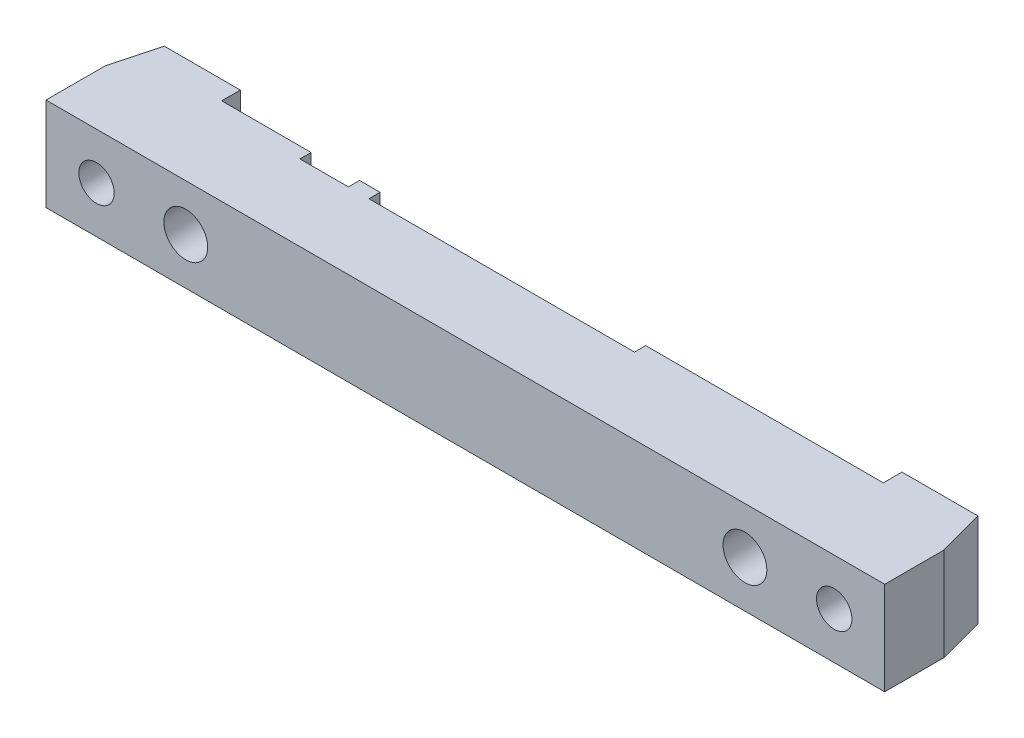
ISO-10303-21;
HEADER;
FILE_DESCRIPTION(('STEP AP214'),'2;1');
FILE_NAME('part.step','',(''),(''),'','','');
FILE_SCHEMA(('AUTOMOTIVE_DESIGN { 1 0 10303 214 1 1 1 1 }'));
ENDSEC;
DATA;
#1=APPLICATION_CONTEXT('core data for automotive mechanical design processes');
#2=APPLICATION_PROTOCOL_DEFINITION('international standard','automotive_design',2000,#1);
#3=PRODUCT_CONTEXT('',#1,'mechanical');
#4=PRODUCT('Part','Part','',(#3));
#5=PRODUCT_RELATED_PRODUCT_CATEGORY('part','',(#4));
#6=PRODUCT_DEFINITION_FORMATION('','',#4);
#7=PRODUCT_DEFINITION_CONTEXT('part definition',#1,'design');
#8=PRODUCT_DEFINITION('design','',#6,#7);
#9=PRODUCT_DEFINITION_SHAPE('','',#8);
#10=(LENGTH_UNIT() NAMED_UNIT(*) SI_UNIT(.MILLI.,.METRE.));
#11=(NAMED_UNIT(*) PLANE_ANGLE_UNIT() SI_UNIT($,.RADIAN.));
#12=(NAMED_UNIT(*) SI_UNIT($,.STERADIAN.) SOLID_ANGLE_UNIT());
#13=UNCERTAINTY_MEASURE_WITH_UNIT(LENGTH_MEASURE(1.E-05),#10,'distance_accuracy_value','');
#14=(GEOMETRIC_REPRESENTATION_CONTEXT(3) GLOBAL_UNCERTAINTY_ASSIGNED_CONTEXT((#13)) GLOBAL_UNIT_ASSIGNED_CONTEXT((#10,
#11,#12)) REPRESENTATION_CONTEXT('',''));
#15=CARTESIAN_POINT('',(0.,0.,0.));
#16=DIRECTION('',(0.,0.,1.));
#17=DIRECTION('',(1.,0.,0.));
#18=AXIS2_PLACEMENT_3D('',#15,#16,#17);
#19=CARTESIAN_POINT('',(0.,0.,0.));
#20=DIRECTION('',(0.,0.,1.));
#21=DIRECTION('',(1.,0.,0.));
#22=AXIS2_PLACEMENT_3D('',#19,#20,#21);
#23=PLANE('',#22);
#24=CARTESIAN_POINT('',(69.1374063877496,2.99883967328099,0.));
#25=DIRECTION('',(0.,0.,1.));
#26=DIRECTION('',(1.,0.,0.));
#27=AXIS2_PLACEMENT_3D('',#24,#25,#26);
#28=CIRCLE('',#27,2.25);
#29=CARTESIAN_POINT('',(71.3874063877496,2.99883967328099,0.));
#30=VERTEX_POINT('',#29);
#31=EDGE_CURVE('E401',#30,#30,#28,.T.);
#32=ORIENTED_EDGE('',*,*,#31,.T.);
#33=EDGE_LOOP('',(#32));
#34=FACE_BOUND('',#33,.T.);
#35=CARTESIAN_POINT('',(75.,5.,0.));
#36=DIRECTION('',(0.,0.,1.));
#37=DIRECTION('',(1.,0.,0.));
#38=AXIS2_PLACEMENT_3D('',#35,#36,#37);
#39=CIRCLE('',#38,1.89864999999999);
#40=CARTESIAN_POINT('',(76.89865,5.,0.));
#41=VERTEX_POINT('',#40);
#42=EDGE_CURVE('E285',#41,#41,#39,.T.);
#43=ORIENTED_EDGE('',*,*,#42,.T.);
#44=EDGE_LOOP('',(#43));
#45=FACE_BOUND('',#44,.T.);
#46=DIRECTION('',(-1.,0.,0.));
#47=VECTOR('',#46,1.);
#48=CARTESIAN_POINT('',(0.,0.500000000000009,0.));
#49=LINE('',#48,#47);
#50=CARTESIAN_POINT('',(70.5,0.5,0.));
#51=VERTEX_POINT('',#50);
#52=CARTESIAN_POINT('',(67.8,0.5,0.));
#53=VERTEX_POINT('',#52);
#54=EDGE_CURVE('E47',#51,#53,#49,.T.);
#55=ORIENTED_EDGE('',*,*,#54,.T.);
#56=DIRECTION('',(0.,-1.,0.));
#57=VECTOR('',#56,1.);
#58=CARTESIAN_POINT('',(67.8,0.,0.));
#59=LINE('',#58,#57);
#60=CARTESIAN_POINT('',(67.8,0.,0.));
#61=VERTEX_POINT('',#60);
#62=EDGE_CURVE('E280',#53,#61,#59,.T.);
#63=ORIENTED_EDGE('',*,*,#62,.T.);
#64=DIRECTION('',(1.,0.,0.));
#65=VECTOR('',#64,1.);
#66=CARTESIAN_POINT('',(0.,0.,0.));
#67=LINE('',#66,#65);
#68=CARTESIAN_POINT('',(55.,0.,0.));
#69=VERTEX_POINT('',#68);
#70=EDGE_CURVE('E218',#69,#61,#67,.T.);
#71=ORIENTED_EDGE('',*,*,#70,.F.);
#72=DIRECTION('',(0.,1.,0.));
#73=VECTOR('',#72,1.);
#74=CARTESIAN_POINT('',(55.,0.,0.));
#75=LINE('',#74,#73);
#76=CARTESIAN_POINT('',(55.,10.,0.));
#77=VERTEX_POINT('',#76);
#78=EDGE_CURVE('E268',#69,#77,#75,.T.);
#79=ORIENTED_EDGE('',*,*,#78,.T.);
#80=DIRECTION('',(-1.,0.,0.));
#81=VECTOR('',#80,1.);
#82=CARTESIAN_POINT('',(0.,10.,0.));
#83=LINE('',#82,#81);
#84=CARTESIAN_POINT('',(80.5,10.,0.));
#85=VERTEX_POINT('',#84);
#86=EDGE_CURVE('E372',#85,#77,#83,.T.);
#87=ORIENTED_EDGE('',*,*,#86,.F.);
#88=DIRECTION('',(0.,1.,0.));
#89=VECTOR('',#88,1.);
#90=CARTESIAN_POINT('',(80.5,10.,0.));
#91=LINE('',#90,#89);
#92=CARTESIAN_POINT('',(80.5,0.,0.));
#93=VERTEX_POINT('',#92);
#94=EDGE_CURVE('E342',#93,#85,#91,.T.);
#95=ORIENTED_EDGE('',*,*,#94,.F.);
#96=CARTESIAN_POINT('',(70.5,0.,0.));
#97=VERTEX_POINT('',#96);
#98=EDGE_CURVE('E367',#97,#93,#67,.T.);
#99=ORIENTED_EDGE('',*,*,#98,.F.);
#100=DIRECTION('',(0.,1.,0.));
#101=VECTOR('',#100,1.);
#102=CARTESIAN_POINT('',(70.5,0.,0.));
#103=LINE('',#102,#101);
#104=EDGE_CURVE('E277',#97,#51,#103,.T.);
#105=ORIENTED_EDGE('',*,*,#104,.T.);
#106=EDGE_LOOP('',(#55,#63,#71,#79,#87,#95,#99,#105));
#107=FACE_BOUND('',#106,.T.);
#108=ADVANCED_FACE('F38',(#34,#45,#107),#23,.F.);
#109=CARTESIAN_POINT('',(15.,5.,0.));
#110=DIRECTION('',(0.,0.,1.));
#111=DIRECTION('',(1.,0.,0.));
#112=AXIS2_PLACEMENT_3D('',#109,#110,#111);
#113=CIRCLE('',#112,1.89864999999999);
#114=CARTESIAN_POINT('',(16.89865,5.,0.));
#115=VERTEX_POINT('',#114);
#116=EDGE_CURVE('E291',#115,#115,#113,.T.);
#117=ORIENTED_EDGE('',*,*,#116,.T.);
#118=EDGE_LOOP('',(#117));
#119=FACE_BOUND('',#118,.T.);
#120=DIRECTION('',(1.,0.,0.));
#121=VECTOR('',#120,1.);
#122=CARTESIAN_POINT('',(0.,8.,0.));
#123=LINE('',#122,#121);
#124=CARTESIAN_POINT('',(19.1,8.,0.));
#125=VERTEX_POINT('',#124);
#126=CARTESIAN_POINT('',(24.3,8.,0.));
#127=VERTEX_POINT('',#126);
#128=EDGE_CURVE('E11',#125,#127,#123,.T.);
#129=ORIENTED_EDGE('',*,*,#128,.T.);
#130=DIRECTION('',(0.,1.,0.));
#131=VECTOR('',#130,1.);
#132=CARTESIAN_POINT('',(24.3,0.,0.));
#133=LINE('',#132,#131);
#134=CARTESIAN_POINT('',(24.3,10.,0.));
#135=VERTEX_POINT('',#134);
#136=EDGE_CURVE('E274',#127,#135,#133,.T.);
#137=ORIENTED_EDGE('',*,*,#136,.T.);
#138=CARTESIAN_POINT('',(26.5,10.,0.));
#139=VERTEX_POINT('',#138);
#140=EDGE_CURVE('E386',#139,#135,#83,.T.);
#141=ORIENTED_EDGE('',*,*,#140,.F.);
#142=DIRECTION('',(0.,-1.,0.));
#143=VECTOR('',#142,1.);
#144=CARTESIAN_POINT('',(26.5,0.,0.));
#145=LINE('',#144,#143);
#146=CARTESIAN_POINT('',(26.5,0.,0.));
#147=VERTEX_POINT('',#146);
#148=EDGE_CURVE('E259',#139,#147,#145,.T.);
#149=ORIENTED_EDGE('',*,*,#148,.T.);
#150=CARTESIAN_POINT('',(22.3174110349954,0.,0.));
#151=VERTEX_POINT('',#150);
#152=EDGE_CURVE('E383',#151,#147,#67,.T.);
#153=ORIENTED_EDGE('',*,*,#152,.F.);
#154=CARTESIAN_POINT('',(20.8774063877496,1.72883967328098,0.));
#155=DIRECTION('',(0.,0.,1.));
#156=DIRECTION('',(1.,0.,0.));
#157=AXIS2_PLACEMENT_3D('',#154,#155,#156);
#158=CIRCLE('',#157,2.25);
#159=CARTESIAN_POINT('',(19.4374017405037,0.,0.));
#160=VERTEX_POINT('',#159);
#161=EDGE_CURVE('E404',#151,#160,#158,.T.);
#162=ORIENTED_EDGE('',*,*,#161,.T.);
#163=CARTESIAN_POINT('',(9.49999999999999,0.,0.));
#164=VERTEX_POINT('',#163);
#165=EDGE_CURVE('E379',#164,#160,#67,.T.);
#166=ORIENTED_EDGE('',*,*,#165,.F.);
#167=DIRECTION('',(0.,-1.,0.));
#168=VECTOR('',#167,1.);
#169=CARTESIAN_POINT('',(9.49999999999999,10.,0.));
#170=LINE('',#169,#168);
#171=CARTESIAN_POINT('',(9.49999999999999,10.,0.));
#172=VERTEX_POINT('',#171);
#173=EDGE_CURVE('E345',#172,#164,#170,.T.);
#174=ORIENTED_EDGE('',*,*,#173,.F.);
#175=CARTESIAN_POINT('',(19.1,10.,0.));
#176=VERTEX_POINT('',#175);
#177=EDGE_CURVE('E382',#176,#172,#83,.T.);
#178=ORIENTED_EDGE('',*,*,#177,.F.);
#179=DIRECTION('',(0.,-1.,0.));
#180=VECTOR('',#179,1.);
#181=CARTESIAN_POINT('',(19.1,0.,0.));
#182=LINE('',#181,#180);
#183=EDGE_CURVE('E271',#176,#125,#182,.T.);
#184=ORIENTED_EDGE('',*,*,#183,.T.);
#185=EDGE_LOOP('',(#129,#137,#141,#149,#153,#162,#166,#174,#178,#184));
#186=FACE_BOUND('',#185,.T.);
#187=ADVANCED_FACE('F452',(#119,#186),#23,.F.);
#188=CARTESIAN_POINT('',(0.,10.,9.35));
#189=DIRECTION('',(1.,0.,0.));
#190=DIRECTION('',(0.,0.,-1.));
#191=AXIS2_PLACEMENT_3D('',#188,#189,#190);
#192=PLANE('',#191);
#193=DIRECTION('',(0.,0.,-1.));
#194=VECTOR('',#193,1.);
#195=CARTESIAN_POINT('',(0.,10.,9.35));
#196=LINE('',#195,#194);
#197=CARTESIAN_POINT('',(0.,10.,9.35));
#198=VERTEX_POINT('',#197);
#199=CARTESIAN_POINT('',(0.,10.,3.00000000000006));
#200=VERTEX_POINT('',#199);
#201=EDGE_CURVE('E378',#198,#200,#196,.T.);
#202=ORIENTED_EDGE('',*,*,#201,.T.);
#203=DIRECTION('',(0.,-1.,0.));
#204=VECTOR('',#203,1.);
#205=CARTESIAN_POINT('',(0.,10.,3.00000000000006));
#206=LINE('',#205,#204);
#207=CARTESIAN_POINT('',(0.,0.,3.00000000000006));
#208=VERTEX_POINT('',#207);
#209=EDGE_CURVE('E491',#200,#208,#206,.T.);
#210=ORIENTED_EDGE('',*,*,#209,.T.);
#211=DIRECTION('',(0.,0.,-1.));
#212=VECTOR('',#211,1.);
#213=CARTESIAN_POINT('',(0.,0.,9.35));
#214=LINE('',#213,#212);
#215=CARTESIAN_POINT('',(0.,0.,9.35));
#216=VERTEX_POINT('',#215);
#217=EDGE_CURVE('E395',#216,#208,#214,.T.);
#218=ORIENTED_EDGE('',*,*,#217,.F.);
#219=DIRECTION('',(0.,-1.,0.));
#220=VECTOR('',#219,1.);
#221=CARTESIAN_POINT('',(0.,10.,9.35));
#222=LINE('',#221,#220);
#223=EDGE_CURVE('E368',#198,#216,#222,.T.);
#224=ORIENTED_EDGE('',*,*,#223,.F.);
#225=EDGE_LOOP('',(#202,#210,#218,#224));
#226=FACE_BOUND('',#225,.T.);
#227=ADVANCED_FACE('F434',(#226),#192,.F.);
#228=CARTESIAN_POINT('',(0.,0.,9.35));
#229=DIRECTION('',(0.,1.,0.));
#230=DIRECTION('',(0.,0.,1.));
#231=AXIS2_PLACEMENT_3D('',#228,#229,#230);
#232=PLANE('',#231);
#233=ORIENTED_EDGE('',*,*,#70,.T.);
#234=DIRECTION('',(0.,0.,-1.));
#235=VECTOR('',#234,1.);
#236=CARTESIAN_POINT('',(67.8,0.,1.2));
#237=LINE('',#236,#235);
#238=CARTESIAN_POINT('',(67.8,0.,1.2));
#239=VERTEX_POINT('',#238);
#240=EDGE_CURVE('E200',#239,#61,#237,.T.);
#241=ORIENTED_EDGE('',*,*,#240,.F.);
#242=DIRECTION('',(-1.,0.,0.));
#243=VECTOR('',#242,1.);
#244=CARTESIAN_POINT('',(67.8,0.,1.2));
#245=LINE('',#244,#243);
#246=CARTESIAN_POINT('',(70.5,0.,1.2));
#247=VERTEX_POINT('',#246);
#248=EDGE_CURVE('E209',#247,#239,#245,.T.);
#249=ORIENTED_EDGE('',*,*,#248,.F.);
#250=DIRECTION('',(0.,0.,-1.));
#251=VECTOR('',#250,1.);
#252=CARTESIAN_POINT('',(70.5,0.,1.2));
#253=LINE('',#252,#251);
#254=EDGE_CURVE('E219',#247,#97,#253,.T.);
#255=ORIENTED_EDGE('',*,*,#254,.T.);
#256=ORIENTED_EDGE('',*,*,#98,.T.);
#257=DIRECTION('',(0.,0.,1.));
#258=VECTOR('',#257,1.);
#259=CARTESIAN_POINT('',(80.5,0.,-2.));
#260=LINE('',#259,#258);
#261=CARTESIAN_POINT('',(80.5,0.,-2.));
#262=VERTEX_POINT('',#261);
#263=EDGE_CURVE('E336',#262,#93,#260,.T.);
#264=ORIENTED_EDGE('',*,*,#263,.F.);
#265=DIRECTION('',(-1.,0.,0.));
#266=VECTOR('',#265,1.);
#267=CARTESIAN_POINT('',(90.,0.,-2.));
#268=LINE('',#267,#266);
#269=CARTESIAN_POINT('',(88.6602540378444,0.,-2.));
#270=VERTEX_POINT('',#269);
#271=EDGE_CURVE('E346',#270,#262,#268,.T.);
#272=ORIENTED_EDGE('',*,*,#271,.F.);
#273=DIRECTION('',(0.258819045102519,0.,0.965925826289069));
#274=VECTOR('',#273,1.);
#275=CARTESIAN_POINT('',(88.6602540378444,0.,-2.));
#276=LINE('',#275,#274);
#277=CARTESIAN_POINT('',(90.,0.,3.00000000000006));
#278=VERTEX_POINT('',#277);
#279=EDGE_CURVE('E480',#270,#278,#276,.T.);
#280=ORIENTED_EDGE('',*,*,#279,.T.);
#281=DIRECTION('',(0.,0.,-1.));
#282=VECTOR('',#281,1.);
#283=CARTESIAN_POINT('',(90.,0.,9.35));
#284=LINE('',#283,#282);
#285=CARTESIAN_POINT('',(90.,0.,9.35));
#286=VERTEX_POINT('',#285);
#287=EDGE_CURVE('E392',#286,#278,#284,.T.);
#288=ORIENTED_EDGE('',*,*,#287,.F.);
#289=DIRECTION('',(1.,0.,0.));
#290=VECTOR('',#289,1.);
#291=CARTESIAN_POINT('',(0.,0.,9.35));
#292=LINE('',#291,#290);
#293=EDGE_CURVE('E371',#216,#286,#292,.T.);
#294=ORIENTED_EDGE('',*,*,#293,.F.);
#295=ORIENTED_EDGE('',*,*,#217,.T.);
#296=DIRECTION('',(-0.258819045102518,0.,0.965925826289069));
#297=VECTOR('',#296,1.);
#298=CARTESIAN_POINT('',(1.33974596215562,0.,-2.));
#299=LINE('',#298,#297);
#300=CARTESIAN_POINT('',(1.33974596215562,0.,-2.));
#301=VERTEX_POINT('',#300);
#302=EDGE_CURVE('E486',#208,#301,#299,.F.);
#303=ORIENTED_EDGE('',*,*,#302,.T.);
#304=DIRECTION('',(-1.,0.,0.));
#305=VECTOR('',#304,1.);
#306=CARTESIAN_POINT('',(0.,0.,-2.));
#307=LINE('',#306,#305);
#308=CARTESIAN_POINT('',(9.49999999999999,0.,-2.));
#309=VERTEX_POINT('',#308);
#310=EDGE_CURVE('E356',#309,#301,#307,.T.);
#311=ORIENTED_EDGE('',*,*,#310,.F.);
#312=DIRECTION('',(0.,0.,1.));
#313=VECTOR('',#312,1.);
#314=CARTESIAN_POINT('',(9.49999999999999,0.,-2.));
#315=LINE('',#314,#313);
#316=EDGE_CURVE('E359',#309,#164,#315,.T.);
#317=ORIENTED_EDGE('',*,*,#316,.T.);
#318=ORIENTED_EDGE('',*,*,#165,.T.);
#319=CARTESIAN_POINT('',(19.4374017405037,0.,0.));
#320=CARTESIAN_POINT('',(19.5068071346716,0.,-0.0443567543977848));
#321=CARTESIAN_POINT('',(19.5770697090858,0.,-0.0874877068534589));
#322=CARTESIAN_POINT('',(19.720000914331,0.,-0.170338062452837));
#323=CARTESIAN_POINT('',(19.7926791572476,0.,-0.21004079270419));
#324=CARTESIAN_POINT('',(19.9423339578243,0.,-0.285569695296811));
#325=CARTESIAN_POINT('',(20.0193724305772,0.,-0.321275167267511));
#326=CARTESIAN_POINT('',(20.1762169791806,0.,-0.385741323157568));
#327=CARTESIAN_POINT('',(20.2560176688651,0.,-0.414514738169362));
#328=CARTESIAN_POINT('',(20.3880250720217,0.,-0.45388549202655));
#329=CARTESIAN_POINT('',(20.4394033885287,0.,-0.467257393353752));
#330=CARTESIAN_POINT('',(20.5430805160929,0.,-0.489857010378197));
#331=CARTESIAN_POINT('',(20.5953793441548,0.,-0.499084649434216));
#332=CARTESIAN_POINT('',(20.7000216902363,0.,-0.512849231118432));
#333=CARTESIAN_POINT('',(20.7523585646676,0.,-0.517435988937625));
#334=CARTESIAN_POINT('',(20.857232558095,0.,-0.521836371970701));
#335=CARTESIAN_POINT('',(20.9097696642561,0.,-0.521650298148926));
#336=CARTESIAN_POINT('',(21.0146030027202,0.,-0.516515358560234));
#337=CARTESIAN_POINT('',(21.0668992587688,0.,-0.511566972872767));
#338=CARTESIAN_POINT('',(21.1708810526617,0.,-0.497186244329025));
#339=CARTESIAN_POINT('',(21.2225662781091,0.,-0.48775170154018));
#340=CARTESIAN_POINT('',(21.3772875561174,0.,-0.453166182198602));
#341=CARTESIAN_POINT('',(21.4789561689956,0.,-0.421798314064904));
#342=CARTESIAN_POINT('',(21.6441621148849,0.,-0.359750803705596));
#343=CARTESIAN_POINT('',(21.7090296963166,0.,-0.332383845713476));
#344=CARTESIAN_POINT('',(21.8369378964841,0.,-0.273546040517652));
#345=CARTESIAN_POINT('',(21.8999771570082,0.,-0.242072233293083));
#346=CARTESIAN_POINT('',(22.0229097430474,0.,-0.176740328259004));
#347=CARTESIAN_POINT('',(22.0828421295265,0.,-0.142954583293593));
#348=CARTESIAN_POINT('',(22.2011814403017,0.,-0.0730690459612366));
#349=CARTESIAN_POINT('',(22.2595912418929,0.,-0.0369741431394287));
#350=CARTESIAN_POINT('',(22.3174110349954,0.,0.));
#351=B_SPLINE_CURVE_WITH_KNOTS('',3,(#319,#320,#321,#322,#323,#324,#325,#326,#327,#328,#329,
#330,#331,#332,#333,#334,#335,#336,#337,#338,#339,#340,#341,#342,#343,#344,#345,#346,#347,#348,
#349,#350),.UNSPECIFIED.,.F.,.F.,(4,2,2,2,2,2,2,2,2,2,2,2,2,2,2,4),(0.,0.247187857201403,
0.495517133864466,0.750011048805005,1.00403394691584,1.16316048209829,1.32228995993968,
1.47969261945211,1.63708535352094,1.79446222279436,1.95191634663264,2.26989205143399,
2.48098705114672,2.6922350472583,2.89857676999575,3.10449517558492),.UNSPECIFIED.);
#352=EDGE_CURVE('E410',#160,#151,#351,.T.);
#353=ORIENTED_EDGE('',*,*,#352,.T.);
#354=ORIENTED_EDGE('',*,*,#152,.T.);
#355=DIRECTION('',(0.,0.,-1.));
#356=VECTOR('',#355,1.);
#357=CARTESIAN_POINT('',(26.5,0.,1.2));
#358=LINE('',#357,#356);
#359=CARTESIAN_POINT('',(26.5,0.,1.2));
#360=VERTEX_POINT('',#359);
#361=EDGE_CURVE('E263',#360,#147,#358,.T.);
#362=ORIENTED_EDGE('',*,*,#361,.F.);
#363=DIRECTION('',(-1.,0.,0.));
#364=VECTOR('',#363,1.);
#365=CARTESIAN_POINT('',(55.,0.,1.2));
#366=LINE('',#365,#364);
#367=CARTESIAN_POINT('',(55.,0.,1.2));
#368=VERTEX_POINT('',#367);
#369=EDGE_CURVE('E248',#368,#360,#366,.T.);
#370=ORIENTED_EDGE('',*,*,#369,.F.);
#371=DIRECTION('',(0.,0.,-1.));
#372=VECTOR('',#371,1.);
#373=CARTESIAN_POINT('',(55.,0.,1.2));
#374=LINE('',#373,#372);
#375=EDGE_CURVE('E256',#368,#69,#374,.T.);
#376=ORIENTED_EDGE('',*,*,#375,.T.);
#377=EDGE_LOOP('',(#233,#241,#249,#255,#256,#264,#272,#280,#288,#294,#295,#303,#311,#317,#318,
#353,#354,#362,#370,#376));
#378=FACE_BOUND('',#377,.T.);
#379=ADVANCED_FACE('F215',(#378),#232,.F.);
#380=CARTESIAN_POINT('',(90.,10.,9.35));
#381=DIRECTION('',(-1.,0.,0.));
#382=DIRECTION('',(0.,0.,1.));
#383=AXIS2_PLACEMENT_3D('',#380,#381,#382);
#384=PLANE('',#383);
#385=ORIENTED_EDGE('',*,*,#287,.T.);
#386=DIRECTION('',(0.,1.,0.));
#387=VECTOR('',#386,1.);
#388=CARTESIAN_POINT('',(90.,10.,3.00000000000006));
#389=LINE('',#388,#387);
#390=CARTESIAN_POINT('',(90.,10.,3.00000000000006));
#391=VERTEX_POINT('',#390);
#392=EDGE_CURVE('E477',#278,#391,#389,.T.);
#393=ORIENTED_EDGE('',*,*,#392,.T.);
#394=DIRECTION('',(0.,0.,-1.));
#395=VECTOR('',#394,1.);
#396=CARTESIAN_POINT('',(90.,10.,9.35));
#397=LINE('',#396,#395);
#398=CARTESIAN_POINT('',(90.,10.,9.35));
#399=VERTEX_POINT('',#398);
#400=EDGE_CURVE('E389',#399,#391,#397,.T.);
#401=ORIENTED_EDGE('',*,*,#400,.F.);
#402=DIRECTION('',(0.,1.,0.));
#403=VECTOR('',#402,1.);
#404=CARTESIAN_POINT('',(90.,10.,9.35));
#405=LINE('',#404,#403);
#406=EDGE_CURVE('E374',#286,#399,#405,.T.);
#407=ORIENTED_EDGE('',*,*,#406,.F.);
#408=EDGE_LOOP('',(#385,#393,#401,#407));
#409=FACE_BOUND('',#408,.T.);
#410=ADVANCED_FACE('F466',(#409),#384,.F.);
#411=CARTESIAN_POINT('',(0.,10.,9.35));
#412=DIRECTION('',(0.,-1.,0.));
#413=DIRECTION('',(0.,0.,-1.));
#414=AXIS2_PLACEMENT_3D('',#411,#412,#413);
#415=PLANE('',#414);
#416=ORIENTED_EDGE('',*,*,#140,.T.);
#417=DIRECTION('',(0.,0.,-1.));
#418=VECTOR('',#417,1.);
#419=CARTESIAN_POINT('',(24.3,10.,1.2));
#420=LINE('',#419,#418);
#421=CARTESIAN_POINT('',(24.3,10.,1.2));
#422=VERTEX_POINT('',#421);
#423=EDGE_CURVE('E241',#422,#135,#420,.T.);
#424=ORIENTED_EDGE('',*,*,#423,.F.);
#425=DIRECTION('',(1.,0.,0.));
#426=VECTOR('',#425,1.);
#427=CARTESIAN_POINT('',(24.3,10.,1.2));
#428=LINE('',#427,#426);
#429=CARTESIAN_POINT('',(19.1,10.,1.2));
#430=VERTEX_POINT('',#429);
#431=EDGE_CURVE('E234',#430,#422,#428,.T.);
#432=ORIENTED_EDGE('',*,*,#431,.F.);
#433=DIRECTION('',(0.,0.,-1.));
#434=VECTOR('',#433,1.);
#435=CARTESIAN_POINT('',(19.1,10.,1.2));
#436=LINE('',#435,#434);
#437=EDGE_CURVE('E238',#430,#176,#436,.T.);
#438=ORIENTED_EDGE('',*,*,#437,.T.);
#439=ORIENTED_EDGE('',*,*,#177,.T.);
#440=DIRECTION('',(0.,0.,1.));
#441=VECTOR('',#440,1.);
#442=CARTESIAN_POINT('',(9.49999999999999,10.,-2.));
#443=LINE('',#442,#441);
#444=CARTESIAN_POINT('',(9.49999999999999,10.,-2.));
#445=VERTEX_POINT('',#444);
#446=EDGE_CURVE('E364',#445,#172,#443,.T.);
#447=ORIENTED_EDGE('',*,*,#446,.F.);
#448=DIRECTION('',(1.,0.,0.));
#449=VECTOR('',#448,1.);
#450=CARTESIAN_POINT('',(0.,10.,-2.));
#451=LINE('',#450,#449);
#452=CARTESIAN_POINT('',(1.33974596215562,10.,-2.));
#453=VERTEX_POINT('',#452);
#454=EDGE_CURVE('E352',#453,#445,#451,.T.);
#455=ORIENTED_EDGE('',*,*,#454,.F.);
#456=DIRECTION('',(0.258819045102518,0.,-0.965925826289069));
#457=VECTOR('',#456,1.);
#458=CARTESIAN_POINT('',(1.33974596215562,10.,-2.));
#459=LINE('',#458,#457);
#460=EDGE_CURVE('E493',#453,#200,#459,.F.);
#461=ORIENTED_EDGE('',*,*,#460,.T.);
#462=ORIENTED_EDGE('',*,*,#201,.F.);
#463=DIRECTION('',(-1.,0.,0.));
#464=VECTOR('',#463,1.);
#465=CARTESIAN_POINT('',(0.,10.,9.35));
#466=LINE('',#465,#464);
#467=EDGE_CURVE('E376',#399,#198,#466,.T.);
#468=ORIENTED_EDGE('',*,*,#467,.F.);
#469=ORIENTED_EDGE('',*,*,#400,.T.);
#470=DIRECTION('',(-0.258819045102519,0.,-0.965925826289069));
#471=VECTOR('',#470,1.);
#472=CARTESIAN_POINT('',(88.6602540378444,10.,-2.));
#473=LINE('',#472,#471);
#474=CARTESIAN_POINT('',(88.6602540378444,10.,-2.));
#475=VERTEX_POINT('',#474);
#476=EDGE_CURVE('E482',#391,#475,#473,.T.);
#477=ORIENTED_EDGE('',*,*,#476,.T.);
#478=DIRECTION('',(1.,0.,0.));
#479=VECTOR('',#478,1.);
#480=CARTESIAN_POINT('',(90.,10.,-2.));
#481=LINE('',#480,#479);
#482=CARTESIAN_POINT('',(80.5,10.,-2.));
#483=VERTEX_POINT('',#482);
#484=EDGE_CURVE('E341',#483,#475,#481,.T.);
#485=ORIENTED_EDGE('',*,*,#484,.F.);
#486=DIRECTION('',(0.,0.,1.));
#487=VECTOR('',#486,1.);
#488=CARTESIAN_POINT('',(80.5,10.,-2.));
#489=LINE('',#488,#487);
#490=EDGE_CURVE('E339',#483,#85,#489,.T.);
#491=ORIENTED_EDGE('',*,*,#490,.T.);
#492=ORIENTED_EDGE('',*,*,#86,.T.);
#493=DIRECTION('',(0.,0.,-1.));
#494=VECTOR('',#493,1.);
#495=CARTESIAN_POINT('',(55.,10.,1.2));
#496=LINE('',#495,#494);
#497=CARTESIAN_POINT('',(55.,10.,1.2));
#498=VERTEX_POINT('',#497);
#499=EDGE_CURVE('E257',#498,#77,#496,.T.);
#500=ORIENTED_EDGE('',*,*,#499,.F.);
#501=DIRECTION('',(1.,0.,0.));
#502=VECTOR('',#501,1.);
#503=CARTESIAN_POINT('',(55.,10.,1.2));
#504=LINE('',#503,#502);
#505=CARTESIAN_POINT('',(26.5,10.,1.2));
#506=VERTEX_POINT('',#505);
#507=EDGE_CURVE('E253',#506,#498,#504,.T.);
#508=ORIENTED_EDGE('',*,*,#507,.F.);
#509=DIRECTION('',(0.,0.,-1.));
#510=VECTOR('',#509,1.);
#511=CARTESIAN_POINT('',(26.5,10.,1.2));
#512=LINE('',#511,#510);
#513=EDGE_CURVE('E260',#506,#139,#512,.T.);
#514=ORIENTED_EDGE('',*,*,#513,.T.);
#515=EDGE_LOOP('',(#416,#424,#432,#438,#439,#447,#455,#461,#462,#468,#469,#477,#485,#491,#492,
#500,#508,#514));
#516=FACE_BOUND('',#515,.T.);
#517=ADVANCED_FACE('F464',(#516),#415,.F.);
#518=CARTESIAN_POINT('',(0.,0.,9.35));
#519=DIRECTION('',(0.,0.,1.));
#520=DIRECTION('',(1.,0.,0.));
#521=AXIS2_PLACEMENT_3D('',#518,#519,#520);
#522=PLANE('',#521);
#523=CARTESIAN_POINT('',(75.,5.,9.35));
#524=DIRECTION('',(0.,0.,1.));
#525=DIRECTION('',(1.,0.,0.));
#526=AXIS2_PLACEMENT_3D('',#523,#524,#525);
#527=CIRCLE('',#526,2.34949999999999);
#528=CARTESIAN_POINT('',(77.3495,5.,9.35));
#529=VERTEX_POINT('',#528);
#530=EDGE_CURVE('E294',#529,#529,#527,.T.);
#531=ORIENTED_EDGE('',*,*,#530,.F.);
#532=EDGE_LOOP('',(#531));
#533=FACE_BOUND('',#532,.T.);
#534=CARTESIAN_POINT('',(15.,5.,9.35));
#535=DIRECTION('',(0.,0.,1.));
#536=DIRECTION('',(1.,0.,0.));
#537=AXIS2_PLACEMENT_3D('',#534,#535,#536);
#538=CIRCLE('',#537,2.34949999999999);
#539=CARTESIAN_POINT('',(17.3495,5.,9.35));
#540=VERTEX_POINT('',#539);
#541=EDGE_CURVE('E300',#540,#540,#538,.T.);
#542=ORIENTED_EDGE('',*,*,#541,.F.);
#543=EDGE_LOOP('',(#542));
#544=FACE_BOUND('',#543,.T.);
#545=CARTESIAN_POINT('',(84.5801270189222,5.,9.35));
#546=DIRECTION('',(0.,0.,-1.));
#547=DIRECTION('',(-1.,0.,0.));
#548=AXIS2_PLACEMENT_3D('',#545,#546,#547);
#549=CIRCLE('',#548,1.89865);
#550=CARTESIAN_POINT('',(82.6814770189222,5.,9.35));
#551=VERTEX_POINT('',#550);
#552=EDGE_CURVE('E309',#551,#551,#549,.T.);
#553=ORIENTED_EDGE('',*,*,#552,.T.);
#554=EDGE_LOOP('',(#553));
#555=FACE_BOUND('',#554,.T.);
#556=CARTESIAN_POINT('',(5.4198729810778,5.,9.35));
#557=DIRECTION('',(0.,0.,-1.));
#558=DIRECTION('',(-1.,0.,0.));
#559=AXIS2_PLACEMENT_3D('',#556,#557,#558);
#560=CIRCLE('',#559,1.89865);
#561=CARTESIAN_POINT('',(3.52122298107781,5.,9.35));
#562=VERTEX_POINT('',#561);
#563=EDGE_CURVE('E315',#562,#562,#560,.T.);
#564=ORIENTED_EDGE('',*,*,#563,.T.);
#565=EDGE_LOOP('',(#564));
#566=FACE_BOUND('',#565,.T.);
#567=ORIENTED_EDGE('',*,*,#223,.T.);
#568=ORIENTED_EDGE('',*,*,#293,.T.);
#569=ORIENTED_EDGE('',*,*,#406,.T.);
#570=ORIENTED_EDGE('',*,*,#467,.T.);
#571=EDGE_LOOP('',(#567,#568,#569,#570));
#572=FACE_BOUND('',#571,.T.);
#573=ADVANCED_FACE('F462',(#533,#544,#555,#566,#572),#522,.T.);
#574=CARTESIAN_POINT('',(9.49999999999999,10.,-2.));
#575=DIRECTION('',(-1.,0.,0.));
#576=DIRECTION('',(0.,-1.,0.));
#577=AXIS2_PLACEMENT_3D('',#574,#575,#576);
#578=PLANE('',#577);
#579=ORIENTED_EDGE('',*,*,#173,.T.);
#580=ORIENTED_EDGE('',*,*,#316,.F.);
#581=DIRECTION('',(0.,-1.,0.));
#582=VECTOR('',#581,1.);
#583=CARTESIAN_POINT('',(9.49999999999999,10.,-2.));
#584=LINE('',#583,#582);
#585=EDGE_CURVE('E354',#445,#309,#584,.T.);
#586=ORIENTED_EDGE('',*,*,#585,.F.);
#587=ORIENTED_EDGE('',*,*,#446,.T.);
#588=EDGE_LOOP('',(#579,#580,#586,#587));
#589=FACE_BOUND('',#588,.T.);
#590=ADVANCED_FACE('F509',(#589),#578,.F.);
#591=CARTESIAN_POINT('',(0.,0.,-2.));
#592=DIRECTION('',(0.,0.,1.));
#593=DIRECTION('',(1.,0.,0.));
#594=AXIS2_PLACEMENT_3D('',#591,#592,#593);
#595=PLANE('',#594);
#596=CARTESIAN_POINT('',(5.4198729810778,5.,-2.));
#597=DIRECTION('',(0.,0.,-1.));
#598=DIRECTION('',(-1.,0.,0.));
#599=AXIS2_PLACEMENT_3D('',#596,#597,#598);
#600=CIRCLE('',#599,2.34949999999999);
#601=CARTESIAN_POINT('',(3.07037298107782,5.,-2.));
#602=VERTEX_POINT('',#601);
#603=EDGE_CURVE('E324',#602,#602,#600,.T.);
#604=ORIENTED_EDGE('',*,*,#603,.F.);
#605=EDGE_LOOP('',(#604));
#606=FACE_BOUND('',#605,.T.);
#607=ORIENTED_EDGE('',*,*,#310,.T.);
#608=DIRECTION('',(0.,1.,0.));
#609=VECTOR('',#608,1.);
#610=CARTESIAN_POINT('',(1.33974596215562,0.,-2.));
#611=LINE('',#610,#609);
#612=EDGE_CURVE('E418',#301,#453,#611,.T.);
#613=ORIENTED_EDGE('',*,*,#612,.T.);
#614=ORIENTED_EDGE('',*,*,#454,.T.);
#615=ORIENTED_EDGE('',*,*,#585,.T.);
#616=EDGE_LOOP('',(#607,#613,#614,#615));
#617=FACE_BOUND('',#616,.T.);
#618=ADVANCED_FACE('F499',(#606,#617),#595,.F.);
#619=CARTESIAN_POINT('',(80.5,10.,-2.));
#620=DIRECTION('',(1.,0.,0.));
#621=DIRECTION('',(0.,0.,-1.));
#622=AXIS2_PLACEMENT_3D('',#619,#620,#621);
#623=PLANE('',#622);
#624=ORIENTED_EDGE('',*,*,#94,.T.);
#625=ORIENTED_EDGE('',*,*,#490,.F.);
#626=DIRECTION('',(0.,1.,0.));
#627=VECTOR('',#626,1.);
#628=CARTESIAN_POINT('',(80.5,10.,-2.));
#629=LINE('',#628,#627);
#630=EDGE_CURVE('E349',#262,#483,#629,.T.);
#631=ORIENTED_EDGE('',*,*,#630,.F.);
#632=ORIENTED_EDGE('',*,*,#263,.T.);
#633=EDGE_LOOP('',(#624,#625,#631,#632));
#634=FACE_BOUND('',#633,.T.);
#635=ADVANCED_FACE('F550',(#634),#623,.F.);
#636=CARTESIAN_POINT('',(0.,0.,-2.));
#637=DIRECTION('',(0.,0.,-1.));
#638=DIRECTION('',(-1.,0.,0.));
#639=AXIS2_PLACEMENT_3D('',#636,#637,#638);
#640=PLANE('',#639);
#641=CARTESIAN_POINT('',(84.5801270189222,5.,-2.));
#642=DIRECTION('',(0.,0.,-1.));
#643=DIRECTION('',(-1.,0.,0.));
#644=AXIS2_PLACEMENT_3D('',#641,#642,#643);
#645=CIRCLE('',#644,2.34949999999999);
#646=CARTESIAN_POINT('',(82.2306270189222,5.,-2.));
#647=VERTEX_POINT('',#646);
#648=EDGE_CURVE('E318',#647,#647,#645,.T.);
#649=ORIENTED_EDGE('',*,*,#648,.F.);
#650=EDGE_LOOP('',(#649));
#651=FACE_BOUND('',#650,.T.);
#652=ORIENTED_EDGE('',*,*,#484,.T.);
#653=DIRECTION('',(0.,-1.,0.));
#654=VECTOR('',#653,1.);
#655=CARTESIAN_POINT('',(88.6602540378444,0.,-2.));
#656=LINE('',#655,#654);
#657=EDGE_CURVE('E483',#475,#270,#656,.T.);
#658=ORIENTED_EDGE('',*,*,#657,.T.);
#659=ORIENTED_EDGE('',*,*,#271,.T.);
#660=ORIENTED_EDGE('',*,*,#630,.T.);
#661=EDGE_LOOP('',(#652,#658,#659,#660));
#662=FACE_BOUND('',#661,.T.);
#663=ADVANCED_FACE('F555',(#651,#662),#640,.T.);
#664=CARTESIAN_POINT('',(69.1374063877496,2.99883967328099,-2.8));
#665=DIRECTION('',(0.,0.,1.));
#666=DIRECTION('',(1.,0.,0.));
#667=AXIS2_PLACEMENT_3D('',#664,#665,#666);
#668=CYLINDRICAL_SURFACE('',#667,1.45);
#669=CARTESIAN_POINT('',(69.1374063877496,2.99883967328099,-0.8));
#670=DIRECTION('',(0.,0.,1.));
#671=DIRECTION('',(1.,0.,0.));
#672=AXIS2_PLACEMENT_3D('',#669,#670,#671);
#673=CIRCLE('',#672,1.45);
#674=CARTESIAN_POINT('',(70.5874063877496,2.99883967328099,-0.8));
#675=VERTEX_POINT('',#674);
#676=EDGE_CURVE('E407',#675,#675,#673,.F.);
#677=ORIENTED_EDGE('',*,*,#676,.T.);
#678=EDGE_LOOP('',(#677));
#679=FACE_BOUND('',#678,.T.);
#680=CARTESIAN_POINT('',(69.1374063877496,2.99883967328099,-2.8));
#681=DIRECTION('',(0.,0.,-1.));
#682=DIRECTION('',(-1.,0.,0.));
#683=AXIS2_PLACEMENT_3D('',#680,#681,#682);
#684=CIRCLE('',#683,1.45);
#685=CARTESIAN_POINT('',(67.6874063877495,2.99883967328099,-2.8));
#686=VERTEX_POINT('',#685);
#687=EDGE_CURVE('E333',#686,#686,#684,.T.);
#688=ORIENTED_EDGE('',*,*,#687,.F.);
#689=EDGE_LOOP('',(#688));
#690=FACE_BOUND('',#689,.T.);
#691=ADVANCED_FACE('F560',(#679,#690),#668,.T.);
#692=CARTESIAN_POINT('',(69.1374063877496,2.99883967328099,-2.8));
#693=DIRECTION('',(0.,0.,-1.));
#694=DIRECTION('',(-1.,0.,0.));
#695=AXIS2_PLACEMENT_3D('',#692,#693,#694);
#696=PLANE('',#695);
#697=ORIENTED_EDGE('',*,*,#687,.T.);
#698=EDGE_LOOP('',(#697));
#699=FACE_BOUND('',#698,.T.);
#700=ADVANCED_FACE('F565',(#699),#696,.T.);
#701=CARTESIAN_POINT('',(20.8774063877496,1.72883967328098,-2.8));
#702=DIRECTION('',(0.,0.,1.));
#703=DIRECTION('',(1.,0.,0.));
#704=AXIS2_PLACEMENT_3D('',#701,#702,#703);
#705=CYLINDRICAL_SURFACE('',#704,1.45);
#706=CARTESIAN_POINT('',(20.8774063877496,1.72883967328098,-0.800000000000015));
#707=DIRECTION('',(0.,0.,1.));
#708=DIRECTION('',(1.,0.,0.));
#709=AXIS2_PLACEMENT_3D('',#706,#707,#708);
#710=CIRCLE('',#709,1.45);
#711=CARTESIAN_POINT('',(22.3274063877496,1.72883967328098,-0.800000000000015));
#712=VERTEX_POINT('',#711);
#713=EDGE_CURVE('E398',#712,#712,#710,.F.);
#714=ORIENTED_EDGE('',*,*,#713,.T.);
#715=EDGE_LOOP('',(#714));
#716=FACE_BOUND('',#715,.T.);
#717=CARTESIAN_POINT('',(20.8774063877496,1.72883967328098,-2.8));
#718=DIRECTION('',(0.,0.,-1.));
#719=DIRECTION('',(-1.,0.,0.));
#720=AXIS2_PLACEMENT_3D('',#717,#718,#719);
#721=CIRCLE('',#720,1.45);
#722=CARTESIAN_POINT('',(19.4274063877496,1.72883967328098,-2.8));
#723=VERTEX_POINT('',#722);
#724=EDGE_CURVE('E330',#723,#723,#721,.T.);
#725=ORIENTED_EDGE('',*,*,#724,.F.);
#726=EDGE_LOOP('',(#725));
#727=FACE_BOUND('',#726,.T.);
#728=ADVANCED_FACE('F569',(#716,#727),#705,.T.);
#729=CARTESIAN_POINT('',(20.8774063877496,1.72883967328098,-2.8));
#730=DIRECTION('',(0.,0.,-1.));
#731=DIRECTION('',(-1.,0.,0.));
#732=AXIS2_PLACEMENT_3D('',#729,#730,#731);
#733=PLANE('',#732);
#734=ORIENTED_EDGE('',*,*,#724,.T.);
#735=EDGE_LOOP('',(#734));
#736=FACE_BOUND('',#735,.T.);
#737=ADVANCED_FACE('F432',(#736),#733,.T.);
#738=CARTESIAN_POINT('',(20.8774063877496,1.72883967328098,-0.800000000000015));
#739=DIRECTION('',(0.,0.,1.));
#740=DIRECTION('',(1.,0.,0.));
#741=AXIS2_PLACEMENT_3D('',#738,#739,#740);
#742=CONICAL_SURFACE('',#741,1.45,0.785398163397441);
#743=ORIENTED_EDGE('',*,*,#352,.F.);
#744=ORIENTED_EDGE('',*,*,#161,.F.);
#745=EDGE_LOOP('',(#743,#744));
#746=FACE_BOUND('',#745,.T.);
#747=ORIENTED_EDGE('',*,*,#713,.F.);
#748=EDGE_LOOP('',(#747));
#749=FACE_BOUND('',#748,.T.);
#750=ADVANCED_FACE('F424',(#746,#749),#742,.T.);
#751=CARTESIAN_POINT('',(69.1374063877496,2.99883967328099,-0.8));
#752=DIRECTION('',(0.,0.,1.));
#753=DIRECTION('',(1.,0.,0.));
#754=AXIS2_PLACEMENT_3D('',#751,#752,#753);
#755=CONICAL_SURFACE('',#754,1.45,0.785398163397449);
#756=ORIENTED_EDGE('',*,*,#31,.F.);
#757=EDGE_LOOP('',(#756));
#758=FACE_BOUND('',#757,.T.);
#759=ORIENTED_EDGE('',*,*,#676,.F.);
#760=EDGE_LOOP('',(#759));
#761=FACE_BOUND('',#760,.T.);
#762=ADVANCED_FACE('F431',(#758,#761),#755,.T.);
#763=CARTESIAN_POINT('',(1.33974596215562,0.,-2.));
#764=DIRECTION('',(0.965925826289069,0.,0.258819045102518));
#765=DIRECTION('',(0.,1.,0.));
#766=AXIS2_PLACEMENT_3D('',#763,#764,#765);
#767=PLANE('',#766);
#768=ORIENTED_EDGE('',*,*,#302,.F.);
#769=ORIENTED_EDGE('',*,*,#209,.F.);
#770=ORIENTED_EDGE('',*,*,#460,.F.);
#771=ORIENTED_EDGE('',*,*,#612,.F.);
#772=EDGE_LOOP('',(#768,#769,#770,#771));
#773=FACE_BOUND('',#772,.T.);
#774=ADVANCED_FACE('F439',(#773),#767,.F.);
#775=CARTESIAN_POINT('',(88.6602540378444,0.,-2.));
#776=DIRECTION('',(0.965925826289069,0.,-0.258819045102519));
#777=DIRECTION('',(0.,1.,0.));
#778=AXIS2_PLACEMENT_3D('',#775,#776,#777);
#779=PLANE('',#778);
#780=ORIENTED_EDGE('',*,*,#476,.F.);
#781=ORIENTED_EDGE('',*,*,#392,.F.);
#782=ORIENTED_EDGE('',*,*,#279,.F.);
#783=ORIENTED_EDGE('',*,*,#657,.F.);
#784=EDGE_LOOP('',(#780,#781,#782,#783));
#785=FACE_BOUND('',#784,.T.);
#786=ADVANCED_FACE('F41',(#785),#779,.T.);
#787=CARTESIAN_POINT('',(5.4198729810778,5.,4.35));
#788=DIRECTION('',(0.,0.,1.));
#789=DIRECTION('',(1.,0.,0.));
#790=AXIS2_PLACEMENT_3D('',#787,#788,#789);
#791=PLANE('',#790);
#792=CARTESIAN_POINT('',(5.4198729810778,5.,4.35));
#793=DIRECTION('',(0.,0.,-1.));
#794=DIRECTION('',(-1.,0.,0.));
#795=AXIS2_PLACEMENT_3D('',#792,#793,#794);
#796=CIRCLE('',#795,1.89864999999999);
#797=CARTESIAN_POINT('',(3.52122298107782,5.,4.35));
#798=VERTEX_POINT('',#797);
#799=EDGE_CURVE('E312',#798,#798,#796,.T.);
#800=ORIENTED_EDGE('',*,*,#799,.F.);
#801=EDGE_LOOP('',(#800));
#802=FACE_BOUND('',#801,.T.);
#803=CARTESIAN_POINT('',(5.4198729810778,5.,4.35));
#804=DIRECTION('',(0.,0.,-1.));
#805=DIRECTION('',(-1.,0.,0.));
#806=AXIS2_PLACEMENT_3D('',#803,#804,#805);
#807=CIRCLE('',#806,2.3495);
#808=CARTESIAN_POINT('',(3.07037298107781,5.,4.35));
#809=VERTEX_POINT('',#808);
#810=EDGE_CURVE('E327',#809,#809,#807,.T.);
#811=ORIENTED_EDGE('',*,*,#810,.T.);
#812=EDGE_LOOP('',(#811));
#813=FACE_BOUND('',#812,.T.);
#814=ADVANCED_FACE('F448',(#802,#813),#791,.F.);
#815=CARTESIAN_POINT('',(5.4198729810778,5.,-2.));
#816=DIRECTION('',(0.,0.,-1.));
#817=DIRECTION('',(-1.,0.,0.));
#818=AXIS2_PLACEMENT_3D('',#815,#816,#817);
#819=CYLINDRICAL_SURFACE('',#818,2.34949999999999);
#820=ORIENTED_EDGE('',*,*,#810,.F.);
#821=EDGE_LOOP('',(#820));
#822=FACE_BOUND('',#821,.T.);
#823=ORIENTED_EDGE('',*,*,#603,.T.);
#824=EDGE_LOOP('',(#823));
#825=FACE_BOUND('',#824,.T.);
#826=ADVANCED_FACE('F539',(#822,#825),#819,.F.);
#827=CARTESIAN_POINT('',(84.5801270189222,5.,4.35));
#828=DIRECTION('',(0.,0.,1.));
#829=DIRECTION('',(1.,0.,0.));
#830=AXIS2_PLACEMENT_3D('',#827,#828,#829);
#831=PLANE('',#830);
#832=CARTESIAN_POINT('',(84.5801270189222,5.,4.35));
#833=DIRECTION('',(0.,0.,-1.));
#834=DIRECTION('',(-1.,0.,0.));
#835=AXIS2_PLACEMENT_3D('',#832,#833,#834);
#836=CIRCLE('',#835,1.89864999999999);
#837=CARTESIAN_POINT('',(82.6814770189222,5.,4.35));
#838=VERTEX_POINT('',#837);
#839=EDGE_CURVE('E306',#838,#838,#836,.T.);
#840=ORIENTED_EDGE('',*,*,#839,.F.);
#841=EDGE_LOOP('',(#840));
#842=FACE_BOUND('',#841,.T.);
#843=CARTESIAN_POINT('',(84.5801270189222,5.,4.35));
#844=DIRECTION('',(0.,0.,-1.));
#845=DIRECTION('',(-1.,0.,0.));
#846=AXIS2_PLACEMENT_3D('',#843,#844,#845);
#847=CIRCLE('',#846,2.3495);
#848=CARTESIAN_POINT('',(82.2306270189222,5.,4.35));
#849=VERTEX_POINT('',#848);
#850=EDGE_CURVE('E321',#849,#849,#847,.T.);
#851=ORIENTED_EDGE('',*,*,#850,.T.);
#852=EDGE_LOOP('',(#851));
#853=FACE_BOUND('',#852,.T.);
#854=ADVANCED_FACE('F545',(#842,#853),#831,.F.);
#855=CARTESIAN_POINT('',(84.5801270189222,5.,-2.));
#856=DIRECTION('',(0.,0.,-1.));
#857=DIRECTION('',(-1.,0.,0.));
#858=AXIS2_PLACEMENT_3D('',#855,#856,#857);
#859=CYLINDRICAL_SURFACE('',#858,2.3495);
#860=ORIENTED_EDGE('',*,*,#850,.F.);
#861=EDGE_LOOP('',(#860));
#862=FACE_BOUND('',#861,.T.);
#863=ORIENTED_EDGE('',*,*,#648,.T.);
#864=EDGE_LOOP('',(#863));
#865=FACE_BOUND('',#864,.T.);
#866=ADVANCED_FACE('F533',(#862,#865),#859,.F.);
#867=CARTESIAN_POINT('',(5.4198729810778,5.,4.35));
#868=DIRECTION('',(0.,0.,-1.));
#869=DIRECTION('',(-1.,0.,0.));
#870=AXIS2_PLACEMENT_3D('',#867,#868,#869);
#871=CYLINDRICAL_SURFACE('',#870,1.89864999999999);
#872=ORIENTED_EDGE('',*,*,#563,.F.);
#873=EDGE_LOOP('',(#872));
#874=FACE_BOUND('',#873,.T.);
#875=ORIENTED_EDGE('',*,*,#799,.T.);
#876=EDGE_LOOP('',(#875));
#877=FACE_BOUND('',#876,.T.);
#878=ADVANCED_FACE('F529',(#874,#877),#871,.F.);
#879=CARTESIAN_POINT('',(84.5801270189222,5.,4.35));
#880=DIRECTION('',(0.,0.,-1.));
#881=DIRECTION('',(-1.,0.,0.));
#882=AXIS2_PLACEMENT_3D('',#879,#880,#881);
#883=CYLINDRICAL_SURFACE('',#882,1.89864999999999);
#884=ORIENTED_EDGE('',*,*,#552,.F.);
#885=EDGE_LOOP('',(#884));
#886=FACE_BOUND('',#885,.T.);
#887=ORIENTED_EDGE('',*,*,#839,.T.);
#888=EDGE_LOOP('',(#887));
#889=FACE_BOUND('',#888,.T.);
#890=ADVANCED_FACE('F532',(#886,#889),#883,.F.);
#891=CARTESIAN_POINT('',(15.,5.,3.00000000000001));
#892=DIRECTION('',(0.,0.,-1.));
#893=DIRECTION('',(-1.,0.,0.));
#894=AXIS2_PLACEMENT_3D('',#891,#892,#893);
#895=PLANE('',#894);
#896=CARTESIAN_POINT('',(15.,5.,3.00000000000001));
#897=DIRECTION('',(0.,0.,1.));
#898=DIRECTION('',(1.,0.,0.));
#899=AXIS2_PLACEMENT_3D('',#896,#897,#898);
#900=CIRCLE('',#899,1.89864999999999);
#901=CARTESIAN_POINT('',(16.89865,5.,3.00000000000001));
#902=VERTEX_POINT('',#901);
#903=EDGE_CURVE('E288',#902,#902,#900,.T.);
#904=ORIENTED_EDGE('',*,*,#903,.F.);
#905=EDGE_LOOP('',(#904));
#906=FACE_BOUND('',#905,.T.);
#907=CARTESIAN_POINT('',(15.,5.,3.00000000000001));
#908=DIRECTION('',(0.,0.,1.));
#909=DIRECTION('',(1.,0.,0.));
#910=AXIS2_PLACEMENT_3D('',#907,#908,#909);
#911=CIRCLE('',#910,2.34949999999999);
#912=CARTESIAN_POINT('',(17.3495,5.,3.00000000000001));
#913=VERTEX_POINT('',#912);
#914=EDGE_CURVE('E303',#913,#913,#911,.T.);
#915=ORIENTED_EDGE('',*,*,#914,.T.);
#916=EDGE_LOOP('',(#915));
#917=FACE_BOUND('',#916,.T.);
#918=ADVANCED_FACE('F585',(#906,#917),#895,.F.);
#919=CARTESIAN_POINT('',(15.,5.,9.35));
#920=DIRECTION('',(0.,0.,1.));
#921=DIRECTION('',(1.,0.,0.));
#922=AXIS2_PLACEMENT_3D('',#919,#920,#921);
#923=CYLINDRICAL_SURFACE('',#922,2.34949999999999);
#924=ORIENTED_EDGE('',*,*,#914,.F.);
#925=EDGE_LOOP('',(#924));
#926=FACE_BOUND('',#925,.T.);
#927=ORIENTED_EDGE('',*,*,#541,.T.);
#928=EDGE_LOOP('',(#927));
#929=FACE_BOUND('',#928,.T.);
#930=ADVANCED_FACE('F589',(#926,#929),#923,.F.);
#931=CARTESIAN_POINT('',(75.,5.,3.));
#932=DIRECTION('',(0.,0.,-1.));
#933=DIRECTION('',(-1.,0.,0.));
#934=AXIS2_PLACEMENT_3D('',#931,#932,#933);
#935=PLANE('',#934);
#936=CARTESIAN_POINT('',(75.,5.,3.));
#937=DIRECTION('',(0.,0.,1.));
#938=DIRECTION('',(1.,0.,0.));
#939=AXIS2_PLACEMENT_3D('',#936,#937,#938);
#940=CIRCLE('',#939,1.89864999999999);
#941=CARTESIAN_POINT('',(76.89865,5.,3.));
#942=VERTEX_POINT('',#941);
#943=EDGE_CURVE('E282',#942,#942,#940,.T.);
#944=ORIENTED_EDGE('',*,*,#943,.F.);
#945=EDGE_LOOP('',(#944));
#946=FACE_BOUND('',#945,.T.);
#947=CARTESIAN_POINT('',(75.,5.,3.00000000000001));
#948=DIRECTION('',(0.,0.,1.));
#949=DIRECTION('',(1.,0.,0.));
#950=AXIS2_PLACEMENT_3D('',#947,#948,#949);
#951=CIRCLE('',#950,2.34949999999999);
#952=CARTESIAN_POINT('',(77.3495,5.,3.00000000000001));
#953=VERTEX_POINT('',#952);
#954=EDGE_CURVE('E297',#953,#953,#951,.T.);
#955=ORIENTED_EDGE('',*,*,#954,.T.);
#956=EDGE_LOOP('',(#955));
#957=FACE_BOUND('',#956,.T.);
#958=ADVANCED_FACE('F593',(#946,#957),#935,.F.);
#959=CARTESIAN_POINT('',(75.,5.,9.35));
#960=DIRECTION('',(0.,0.,1.));
#961=DIRECTION('',(1.,0.,0.));
#962=AXIS2_PLACEMENT_3D('',#959,#960,#961);
#963=CYLINDRICAL_SURFACE('',#962,2.34949999999999);
#964=ORIENTED_EDGE('',*,*,#954,.F.);
#965=EDGE_LOOP('',(#964));
#966=FACE_BOUND('',#965,.T.);
#967=ORIENTED_EDGE('',*,*,#530,.T.);
#968=EDGE_LOOP('',(#967));
#969=FACE_BOUND('',#968,.T.);
#970=ADVANCED_FACE('F597',(#966,#969),#963,.F.);
#971=CARTESIAN_POINT('',(15.,5.,3.00000000000001));
#972=DIRECTION('',(0.,0.,1.));
#973=DIRECTION('',(1.,0.,0.));
#974=AXIS2_PLACEMENT_3D('',#971,#972,#973);
#975=CYLINDRICAL_SURFACE('',#974,1.89864999999999);
#976=ORIENTED_EDGE('',*,*,#903,.T.);
#977=EDGE_LOOP('',(#976));
#978=FACE_BOUND('',#977,.T.);
#979=ORIENTED_EDGE('',*,*,#116,.F.);
#980=EDGE_LOOP('',(#979));
#981=FACE_BOUND('',#980,.T.);
#982=ADVANCED_FACE('F601',(#978,#981),#975,.F.);
#983=CARTESIAN_POINT('',(75.,5.,3.));
#984=DIRECTION('',(0.,0.,1.));
#985=DIRECTION('',(1.,0.,0.));
#986=AXIS2_PLACEMENT_3D('',#983,#984,#985);
#987=CYLINDRICAL_SURFACE('',#986,1.89864999999999);
#988=ORIENTED_EDGE('',*,*,#943,.T.);
#989=EDGE_LOOP('',(#988));
#990=FACE_BOUND('',#989,.T.);
#991=ORIENTED_EDGE('',*,*,#42,.F.);
#992=EDGE_LOOP('',(#991));
#993=FACE_BOUND('',#992,.T.);
#994=ADVANCED_FACE('F605',(#990,#993),#987,.F.);
#995=CARTESIAN_POINT('',(55.,10.,1.2));
#996=DIRECTION('',(1.,0.,0.));
#997=DIRECTION('',(0.,0.,-1.));
#998=AXIS2_PLACEMENT_3D('',#995,#996,#997);
#999=PLANE('',#998);
#1000=ORIENTED_EDGE('',*,*,#375,.F.);
#1001=DIRECTION('',(0.,-1.,0.));
#1002=VECTOR('',#1001,1.);
#1003=CARTESIAN_POINT('',(55.,10.,1.2));
#1004=LINE('',#1003,#1002);
#1005=EDGE_CURVE('E205',#498,#368,#1004,.T.);
#1006=ORIENTED_EDGE('',*,*,#1005,.F.);
#1007=ORIENTED_EDGE('',*,*,#499,.T.);
#1008=ORIENTED_EDGE('',*,*,#78,.F.);
#1009=EDGE_LOOP('',(#1000,#1006,#1007,#1008));
#1010=FACE_BOUND('',#1009,.T.);
#1011=ADVANCED_FACE('F609',(#1010),#999,.F.);
#1012=CARTESIAN_POINT('',(26.5,10.,1.2));
#1013=DIRECTION('',(-1.,0.,0.));
#1014=DIRECTION('',(0.,0.,1.));
#1015=AXIS2_PLACEMENT_3D('',#1012,#1013,#1014);
#1016=PLANE('',#1015);
#1017=ORIENTED_EDGE('',*,*,#513,.F.);
#1018=DIRECTION('',(0.,1.,0.));
#1019=VECTOR('',#1018,1.);
#1020=CARTESIAN_POINT('',(26.5,10.,1.2));
#1021=LINE('',#1020,#1019);
#1022=EDGE_CURVE('E251',#360,#506,#1021,.T.);
#1023=ORIENTED_EDGE('',*,*,#1022,.F.);
#1024=ORIENTED_EDGE('',*,*,#361,.T.);
#1025=ORIENTED_EDGE('',*,*,#148,.F.);
#1026=EDGE_LOOP('',(#1017,#1023,#1024,#1025));
#1027=FACE_BOUND('',#1026,.T.);
#1028=ADVANCED_FACE('F613',(#1027),#1016,.F.);
#1029=CARTESIAN_POINT('',(0.,0.,1.2));
#1030=DIRECTION('',(0.,0.,-1.));
#1031=DIRECTION('',(-1.,0.,0.));
#1032=AXIS2_PLACEMENT_3D('',#1029,#1030,#1031);
#1033=PLANE('',#1032);
#1034=ORIENTED_EDGE('',*,*,#1005,.T.);
#1035=ORIENTED_EDGE('',*,*,#369,.T.);
#1036=ORIENTED_EDGE('',*,*,#1022,.T.);
#1037=ORIENTED_EDGE('',*,*,#507,.T.);
#1038=EDGE_LOOP('',(#1034,#1035,#1036,#1037));
#1039=FACE_BOUND('',#1038,.T.);
#1040=ADVANCED_FACE('F617',(#1039),#1033,.T.);
#1041=CARTESIAN_POINT('',(24.3,8.,1.2));
#1042=DIRECTION('',(0.,-1.,0.));
#1043=DIRECTION('',(0.,0.,-1.));
#1044=AXIS2_PLACEMENT_3D('',#1041,#1042,#1043);
#1045=PLANE('',#1044);
#1046=DIRECTION('',(0.,0.,-1.));
#1047=VECTOR('',#1046,1.);
#1048=CARTESIAN_POINT('',(19.1,8.,1.2));
#1049=LINE('',#1048,#1047);
#1050=CARTESIAN_POINT('',(19.1,8.,1.2));
#1051=VERTEX_POINT('',#1050);
#1052=EDGE_CURVE('E235',#1051,#125,#1049,.T.);
#1053=ORIENTED_EDGE('',*,*,#1052,.F.);
#1054=DIRECTION('',(-1.,0.,0.));
#1055=VECTOR('',#1054,1.);
#1056=CARTESIAN_POINT('',(24.3,8.,1.2));
#1057=LINE('',#1056,#1055);
#1058=CARTESIAN_POINT('',(24.3,8.,1.2));
#1059=VERTEX_POINT('',#1058);
#1060=EDGE_CURVE('E225',#1059,#1051,#1057,.T.);
#1061=ORIENTED_EDGE('',*,*,#1060,.F.);
#1062=DIRECTION('',(0.,0.,-1.));
#1063=VECTOR('',#1062,1.);
#1064=CARTESIAN_POINT('',(24.3,8.,1.2));
#1065=LINE('',#1064,#1063);
#1066=EDGE_CURVE('E231',#1059,#127,#1065,.T.);
#1067=ORIENTED_EDGE('',*,*,#1066,.T.);
#1068=ORIENTED_EDGE('',*,*,#128,.F.);
#1069=EDGE_LOOP('',(#1053,#1061,#1067,#1068));
#1070=FACE_BOUND('',#1069,.T.);
#1071=ADVANCED_FACE('F621',(#1070),#1045,.F.);
#1072=CARTESIAN_POINT('',(24.3,10.,1.2));
#1073=DIRECTION('',(1.,0.,0.));
#1074=DIRECTION('',(0.,1.,0.));
#1075=AXIS2_PLACEMENT_3D('',#1072,#1073,#1074);
#1076=PLANE('',#1075);
#1077=ORIENTED_EDGE('',*,*,#1066,.F.);
#1078=DIRECTION('',(0.,-1.,0.));
#1079=VECTOR('',#1078,1.);
#1080=CARTESIAN_POINT('',(24.3,10.,1.2));
#1081=LINE('',#1080,#1079);
#1082=EDGE_CURVE('E220',#422,#1059,#1081,.T.);
#1083=ORIENTED_EDGE('',*,*,#1082,.F.);
#1084=ORIENTED_EDGE('',*,*,#423,.T.);
#1085=ORIENTED_EDGE('',*,*,#136,.F.);
#1086=EDGE_LOOP('',(#1077,#1083,#1084,#1085));
#1087=FACE_BOUND('',#1086,.T.);
#1088=ADVANCED_FACE('F630',(#1087),#1076,.F.);
#1089=CARTESIAN_POINT('',(19.1,10.,1.2));
#1090=DIRECTION('',(-1.,0.,0.));
#1091=DIRECTION('',(0.,0.,1.));
#1092=AXIS2_PLACEMENT_3D('',#1089,#1090,#1091);
#1093=PLANE('',#1092);
#1094=ORIENTED_EDGE('',*,*,#437,.F.);
#1095=DIRECTION('',(0.,1.,0.));
#1096=VECTOR('',#1095,1.);
#1097=CARTESIAN_POINT('',(19.1,10.,1.2));
#1098=LINE('',#1097,#1096);
#1099=EDGE_CURVE('E62',#1051,#430,#1098,.T.);
#1100=ORIENTED_EDGE('',*,*,#1099,.F.);
#1101=ORIENTED_EDGE('',*,*,#1052,.T.);
#1102=ORIENTED_EDGE('',*,*,#183,.F.);
#1103=EDGE_LOOP('',(#1094,#1100,#1101,#1102));
#1104=FACE_BOUND('',#1103,.T.);
#1105=ADVANCED_FACE('F627',(#1104),#1093,.F.);
#1106=CARTESIAN_POINT('',(0.,0.,1.2));
#1107=DIRECTION('',(0.,0.,-1.));
#1108=DIRECTION('',(-1.,0.,0.));
#1109=AXIS2_PLACEMENT_3D('',#1106,#1107,#1108);
#1110=PLANE('',#1109);
#1111=ORIENTED_EDGE('',*,*,#1082,.T.);
#1112=ORIENTED_EDGE('',*,*,#1060,.T.);
#1113=ORIENTED_EDGE('',*,*,#1099,.T.);
#1114=ORIENTED_EDGE('',*,*,#431,.T.);
#1115=EDGE_LOOP('',(#1111,#1112,#1113,#1114));
#1116=FACE_BOUND('',#1115,.T.);
#1117=ADVANCED_FACE('F623',(#1116),#1110,.T.);
#1118=CARTESIAN_POINT('',(67.8,0.5,1.2));
#1119=DIRECTION('',(0.,1.,0.));
#1120=DIRECTION('',(-1.,0.,0.));
#1121=AXIS2_PLACEMENT_3D('',#1118,#1119,#1120);
#1122=PLANE('',#1121);
#1123=DIRECTION('',(0.,0.,-1.));
#1124=VECTOR('',#1123,1.);
#1125=CARTESIAN_POINT('',(70.5,0.5,1.2));
#1126=LINE('',#1125,#1124);
#1127=CARTESIAN_POINT('',(70.5,0.5,1.2));
#1128=VERTEX_POINT('',#1127);
#1129=EDGE_CURVE('E222',#1128,#51,#1126,.T.);
#1130=ORIENTED_EDGE('',*,*,#1129,.F.);
#1131=DIRECTION('',(1.,0.,0.));
#1132=VECTOR('',#1131,1.);
#1133=CARTESIAN_POINT('',(67.8,0.5,1.2));
#1134=LINE('',#1133,#1132);
#1135=CARTESIAN_POINT('',(67.8,0.5,1.2));
#1136=VERTEX_POINT('',#1135);
#1137=EDGE_CURVE('E206',#1136,#1128,#1134,.T.);
#1138=ORIENTED_EDGE('',*,*,#1137,.F.);
#1139=DIRECTION('',(0.,0.,-1.));
#1140=VECTOR('',#1139,1.);
#1141=CARTESIAN_POINT('',(67.8,0.5,1.2));
#1142=LINE('',#1141,#1140);
#1143=EDGE_CURVE('E203',#1136,#53,#1142,.T.);
#1144=ORIENTED_EDGE('',*,*,#1143,.T.);
#1145=ORIENTED_EDGE('',*,*,#54,.F.);
#1146=EDGE_LOOP('',(#1130,#1138,#1144,#1145));
#1147=FACE_BOUND('',#1146,.T.);
#1148=ADVANCED_FACE('F626',(#1147),#1122,.F.);
#1149=CARTESIAN_POINT('',(67.8,0.,1.2));
#1150=DIRECTION('',(-1.,0.,0.));
#1151=DIRECTION('',(0.,0.,1.));
#1152=AXIS2_PLACEMENT_3D('',#1149,#1150,#1151);
#1153=PLANE('',#1152);
#1154=ORIENTED_EDGE('',*,*,#1143,.F.);
#1155=DIRECTION('',(0.,1.,0.));
#1156=VECTOR('',#1155,1.);
#1157=CARTESIAN_POINT('',(67.8,0.,1.2));
#1158=LINE('',#1157,#1156);
#1159=EDGE_CURVE('E197',#239,#1136,#1158,.T.);
#1160=ORIENTED_EDGE('',*,*,#1159,.F.);
#1161=ORIENTED_EDGE('',*,*,#240,.T.);
#1162=ORIENTED_EDGE('',*,*,#62,.F.);
#1163=EDGE_LOOP('',(#1154,#1160,#1161,#1162));
#1164=FACE_BOUND('',#1163,.T.);
#1165=ADVANCED_FACE('F198',(#1164),#1153,.F.);
#1166=CARTESIAN_POINT('',(70.5,0.,1.2));
#1167=DIRECTION('',(1.,0.,0.));
#1168=DIRECTION('',(0.,0.,-1.));
#1169=AXIS2_PLACEMENT_3D('',#1166,#1167,#1168);
#1170=PLANE('',#1169);
#1171=ORIENTED_EDGE('',*,*,#254,.F.);
#1172=DIRECTION('',(0.,-1.,0.));
#1173=VECTOR('',#1172,1.);
#1174=CARTESIAN_POINT('',(70.5,0.,1.2));
#1175=LINE('',#1174,#1173);
#1176=EDGE_CURVE('E54',#1128,#247,#1175,.T.);
#1177=ORIENTED_EDGE('',*,*,#1176,.F.);
#1178=ORIENTED_EDGE('',*,*,#1129,.T.);
#1179=ORIENTED_EDGE('',*,*,#104,.F.);
#1180=EDGE_LOOP('',(#1171,#1177,#1178,#1179));
#1181=FACE_BOUND('',#1180,.T.);
#1182=ADVANCED_FACE('F640',(#1181),#1170,.F.);
#1183=CARTESIAN_POINT('',(0.,0.,1.2));
#1184=DIRECTION('',(0.,0.,-1.));
#1185=DIRECTION('',(-1.,0.,0.));
#1186=AXIS2_PLACEMENT_3D('',#1183,#1184,#1185);
#1187=PLANE('',#1186);
#1188=ORIENTED_EDGE('',*,*,#1159,.T.);
#1189=ORIENTED_EDGE('',*,*,#1137,.T.);
#1190=ORIENTED_EDGE('',*,*,#1176,.T.);
#1191=ORIENTED_EDGE('',*,*,#248,.T.);
#1192=EDGE_LOOP('',(#1188,#1189,#1190,#1191));
#1193=FACE_BOUND('',#1192,.T.);
#1194=ADVANCED_FACE('F210',(#1193),#1187,.T.);
#1195=CLOSED_SHELL('',(#108,#187,#227,#379,#410,#517,#573,#590,#618,#635,#663,#691,#700,#728,
#737,#750,#762,#774,#786,#814,#826,#854,#866,#878,#890,#918,#930,#958,#970,#982,#994,#1011,
#1028,#1040,#1071,#1088,#1105,#1117,#1148,#1165,#1182,#1194));
#1196=MANIFOLD_SOLID_BREP('B2',#1195);
#1197=ADVANCED_BREP_SHAPE_REPRESENTATION('',(#18,#1196),#14);
#1198=SHAPE_DEFINITION_REPRESENTATION(#9,#1197);
ENDSEC;
END-ISO-10303-21;
